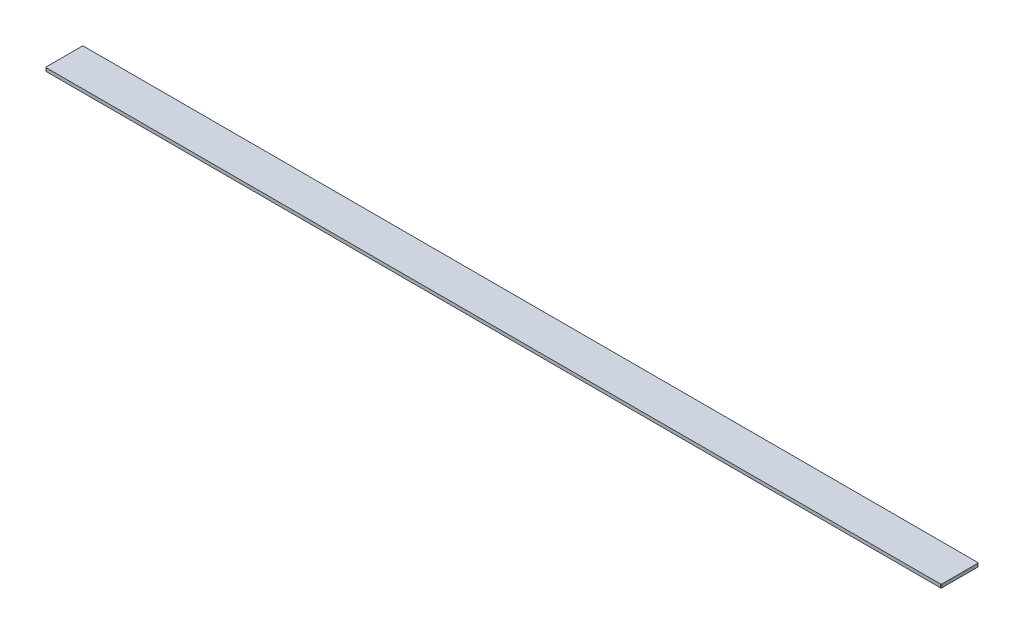
ISO-10303-21;
HEADER;
FILE_DESCRIPTION(('STEP AP214'),'2;1');
FILE_NAME('part.step','',(''),(''),'','','');
FILE_SCHEMA(('AUTOMOTIVE_DESIGN { 1 0 10303 214 1 1 1 1 }'));
ENDSEC;
DATA;
#1=APPLICATION_CONTEXT('core data for automotive mechanical design processes');
#2=APPLICATION_PROTOCOL_DEFINITION('international standard','automotive_design',2000,#1);
#3=PRODUCT_CONTEXT('',#1,'mechanical');
#4=PRODUCT('Part','Part','',(#3));
#5=PRODUCT_RELATED_PRODUCT_CATEGORY('part','',(#4));
#6=PRODUCT_DEFINITION_FORMATION('','',#4);
#7=PRODUCT_DEFINITION_CONTEXT('part definition',#1,'design');
#8=PRODUCT_DEFINITION('design','',#6,#7);
#9=PRODUCT_DEFINITION_SHAPE('','',#8);
#10=(LENGTH_UNIT() NAMED_UNIT(*) SI_UNIT(.MILLI.,.METRE.));
#11=(NAMED_UNIT(*) PLANE_ANGLE_UNIT() SI_UNIT($,.RADIAN.));
#12=(NAMED_UNIT(*) SI_UNIT($,.STERADIAN.) SOLID_ANGLE_UNIT());
#13=UNCERTAINTY_MEASURE_WITH_UNIT(LENGTH_MEASURE(1.E-05),#10,'distance_accuracy_value','');
#14=(GEOMETRIC_REPRESENTATION_CONTEXT(3) GLOBAL_UNCERTAINTY_ASSIGNED_CONTEXT((#13)) GLOBAL_UNIT_ASSIGNED_CONTEXT((#10,
#11,#12)) REPRESENTATION_CONTEXT('',''));
#15=CARTESIAN_POINT('',(0.,0.,0.));
#16=DIRECTION('',(0.,0.,1.));
#17=DIRECTION('',(1.,0.,0.));
#18=AXIS2_PLACEMENT_3D('',#15,#16,#17);
#19=CARTESIAN_POINT('',(-270.,2.,11.25));
#20=DIRECTION('',(1.,0.,0.));
#21=DIRECTION('',(0.,0.,-1.));
#22=AXIS2_PLACEMENT_3D('',#19,#20,#21);
#23=PLANE('',#22);
#24=DIRECTION('',(0.,0.,1.));
#25=VECTOR('',#24,1.);
#26=CARTESIAN_POINT('',(-270.,2.,11.25));
#27=LINE('',#26,#25);
#28=CARTESIAN_POINT('',(-270.,2.,-10.75));
#29=VERTEX_POINT('',#28);
#30=CARTESIAN_POINT('',(-270.,2.,10.75));
#31=VERTEX_POINT('',#30);
#32=EDGE_CURVE('E120',#29,#31,#27,.T.);
#33=ORIENTED_EDGE('',*,*,#32,.F.);
#34=DIRECTION('',(0.,-1.,0.));
#35=VECTOR('',#34,1.);
#36=CARTESIAN_POINT('',(-270.,2.,-10.75));
#37=LINE('',#36,#35);
#38=CARTESIAN_POINT('',(-270.,0.,-10.75));
#39=VERTEX_POINT('',#38);
#40=EDGE_CURVE('E105',#29,#39,#37,.T.);
#41=ORIENTED_EDGE('',*,*,#40,.T.);
#42=DIRECTION('',(0.,0.,1.));
#43=VECTOR('',#42,1.);
#44=CARTESIAN_POINT('',(-270.,0.,11.25));
#45=LINE('',#44,#43);
#46=CARTESIAN_POINT('',(-270.,0.,10.75));
#47=VERTEX_POINT('',#46);
#48=EDGE_CURVE('E117',#39,#47,#45,.T.);
#49=ORIENTED_EDGE('',*,*,#48,.T.);
#50=DIRECTION('',(0.,-1.,0.));
#51=VECTOR('',#50,1.);
#52=CARTESIAN_POINT('',(-270.,2.,10.75));
#53=LINE('',#52,#51);
#54=EDGE_CURVE('E122',#47,#31,#53,.F.);
#55=ORIENTED_EDGE('',*,*,#54,.T.);
#56=EDGE_LOOP('',(#33,#41,#49,#55));
#57=FACE_BOUND('',#56,.T.);
#58=ADVANCED_FACE('F35',(#57),#23,.F.);
#59=CARTESIAN_POINT('',(270.,2.,11.25));
#60=DIRECTION('',(0.,0.,-1.));
#61=DIRECTION('',(-1.,0.,0.));
#62=AXIS2_PLACEMENT_3D('',#59,#60,#61);
#63=PLANE('',#62);
#64=DIRECTION('',(1.,0.,0.));
#65=VECTOR('',#64,1.);
#66=CARTESIAN_POINT('',(270.,0.,11.25));
#67=LINE('',#66,#65);
#68=CARTESIAN_POINT('',(-269.5,0.,11.25));
#69=VERTEX_POINT('',#68);
#70=CARTESIAN_POINT('',(269.5,0.,11.25));
#71=VERTEX_POINT('',#70);
#72=EDGE_CURVE('E126',#69,#71,#67,.T.);
#73=ORIENTED_EDGE('',*,*,#72,.T.);
#74=DIRECTION('',(0.,-1.,0.));
#75=VECTOR('',#74,1.);
#76=CARTESIAN_POINT('',(269.5,2.,11.25));
#77=LINE('',#76,#75);
#78=CARTESIAN_POINT('',(269.5,2.,11.25));
#79=VERTEX_POINT('',#78);
#80=EDGE_CURVE('E11',#71,#79,#77,.F.);
#81=ORIENTED_EDGE('',*,*,#80,.T.);
#82=DIRECTION('',(1.,0.,0.));
#83=VECTOR('',#82,1.);
#84=CARTESIAN_POINT('',(270.,2.,11.25));
#85=LINE('',#84,#83);
#86=CARTESIAN_POINT('',(-269.5,2.,11.25));
#87=VERTEX_POINT('',#86);
#88=EDGE_CURVE('E162',#87,#79,#85,.T.);
#89=ORIENTED_EDGE('',*,*,#88,.F.);
#90=DIRECTION('',(0.,-1.,0.));
#91=VECTOR('',#90,1.);
#92=CARTESIAN_POINT('',(-269.5,2.,11.25));
#93=LINE('',#92,#91);
#94=EDGE_CURVE('E43',#87,#69,#93,.T.);
#95=ORIENTED_EDGE('',*,*,#94,.T.);
#96=EDGE_LOOP('',(#73,#81,#89,#95));
#97=FACE_BOUND('',#96,.T.);
#98=ADVANCED_FACE('F160',(#97),#63,.F.);
#99=CARTESIAN_POINT('',(270.,2.,11.25));
#100=DIRECTION('',(-1.,0.,0.));
#101=DIRECTION('',(0.,0.,1.));
#102=AXIS2_PLACEMENT_3D('',#99,#100,#101);
#103=PLANE('',#102);
#104=DIRECTION('',(0.,0.,-1.));
#105=VECTOR('',#104,1.);
#106=CARTESIAN_POINT('',(270.,0.,11.25));
#107=LINE('',#106,#105);
#108=CARTESIAN_POINT('',(270.,0.,10.75));
#109=VERTEX_POINT('',#108);
#110=CARTESIAN_POINT('',(270.,0.,-10.75));
#111=VERTEX_POINT('',#110);
#112=EDGE_CURVE('E129',#109,#111,#107,.T.);
#113=ORIENTED_EDGE('',*,*,#112,.T.);
#114=DIRECTION('',(0.,-1.,0.));
#115=VECTOR('',#114,1.);
#116=CARTESIAN_POINT('',(270.,2.,-10.75));
#117=LINE('',#116,#115);
#118=CARTESIAN_POINT('',(270.,2.,-10.75));
#119=VERTEX_POINT('',#118);
#120=EDGE_CURVE('E50',#111,#119,#117,.F.);
#121=ORIENTED_EDGE('',*,*,#120,.T.);
#122=DIRECTION('',(0.,0.,-1.));
#123=VECTOR('',#122,1.);
#124=CARTESIAN_POINT('',(270.,2.,11.25));
#125=LINE('',#124,#123);
#126=CARTESIAN_POINT('',(270.,2.,10.75));
#127=VERTEX_POINT('',#126);
#128=EDGE_CURVE('E170',#127,#119,#125,.T.);
#129=ORIENTED_EDGE('',*,*,#128,.F.);
#130=DIRECTION('',(0.,-1.,0.));
#131=VECTOR('',#130,1.);
#132=CARTESIAN_POINT('',(270.,2.,10.75));
#133=LINE('',#132,#131);
#134=EDGE_CURVE('E153',#127,#109,#133,.T.);
#135=ORIENTED_EDGE('',*,*,#134,.T.);
#136=EDGE_LOOP('',(#113,#121,#129,#135));
#137=FACE_BOUND('',#136,.T.);
#138=ADVANCED_FACE('F169',(#137),#103,.F.);
#139=CARTESIAN_POINT('',(270.,2.,-11.25));
#140=DIRECTION('',(0.,0.,1.));
#141=DIRECTION('',(1.,0.,0.));
#142=AXIS2_PLACEMENT_3D('',#139,#140,#141);
#143=PLANE('',#142);
#144=DIRECTION('',(-1.,0.,0.));
#145=VECTOR('',#144,1.);
#146=CARTESIAN_POINT('',(270.,0.,-11.25));
#147=LINE('',#146,#145);
#148=CARTESIAN_POINT('',(269.5,0.,-11.25));
#149=VERTEX_POINT('',#148);
#150=CARTESIAN_POINT('',(-269.5,0.,-11.25));
#151=VERTEX_POINT('',#150);
#152=EDGE_CURVE('E136',#149,#151,#147,.T.);
#153=ORIENTED_EDGE('',*,*,#152,.T.);
#154=DIRECTION('',(0.,-1.,0.));
#155=VECTOR('',#154,1.);
#156=CARTESIAN_POINT('',(-269.5,2.,-11.25));
#157=LINE('',#156,#155);
#158=CARTESIAN_POINT('',(-269.5,2.,-11.25));
#159=VERTEX_POINT('',#158);
#160=EDGE_CURVE('E106',#151,#159,#157,.F.);
#161=ORIENTED_EDGE('',*,*,#160,.T.);
#162=DIRECTION('',(-1.,0.,0.));
#163=VECTOR('',#162,1.);
#164=CARTESIAN_POINT('',(270.,2.,-11.25));
#165=LINE('',#164,#163);
#166=CARTESIAN_POINT('',(269.5,2.,-11.25));
#167=VERTEX_POINT('',#166);
#168=EDGE_CURVE('E132',#167,#159,#165,.T.);
#169=ORIENTED_EDGE('',*,*,#168,.F.);
#170=DIRECTION('',(0.,-1.,0.));
#171=VECTOR('',#170,1.);
#172=CARTESIAN_POINT('',(269.5,2.,-11.25));
#173=LINE('',#172,#171);
#174=EDGE_CURVE('E111',#167,#149,#173,.T.);
#175=ORIENTED_EDGE('',*,*,#174,.T.);
#176=EDGE_LOOP('',(#153,#161,#169,#175));
#177=FACE_BOUND('',#176,.T.);
#178=ADVANCED_FACE('F198',(#177),#143,.F.);
#179=CARTESIAN_POINT('',(0.,2.,0.));
#180=DIRECTION('',(0.,1.,0.));
#181=DIRECTION('',(0.,0.,1.));
#182=AXIS2_PLACEMENT_3D('',#179,#180,#181);
#183=PLANE('',#182);
#184=ORIENTED_EDGE('',*,*,#168,.T.);
#185=CARTESIAN_POINT('',(-269.5,2.,-10.75));
#186=DIRECTION('',(0.,1.,0.));
#187=DIRECTION('',(0.,0.,1.));
#188=AXIS2_PLACEMENT_3D('',#185,#186,#187);
#189=CIRCLE('',#188,0.5);
#190=EDGE_CURVE('E151',#159,#29,#189,.T.);
#191=ORIENTED_EDGE('',*,*,#190,.T.);
#192=ORIENTED_EDGE('',*,*,#32,.T.);
#193=CARTESIAN_POINT('',(-269.5,2.,10.75));
#194=DIRECTION('',(0.,1.,0.));
#195=DIRECTION('',(0.,0.,1.));
#196=AXIS2_PLACEMENT_3D('',#193,#194,#195);
#197=CIRCLE('',#196,0.5);
#198=EDGE_CURVE('E146',#31,#87,#197,.T.);
#199=ORIENTED_EDGE('',*,*,#198,.T.);
#200=ORIENTED_EDGE('',*,*,#88,.T.);
#201=CARTESIAN_POINT('',(269.5,2.,10.75));
#202=DIRECTION('',(0.,1.,0.));
#203=DIRECTION('',(0.,0.,1.));
#204=AXIS2_PLACEMENT_3D('',#201,#202,#203);
#205=CIRCLE('',#204,0.5);
#206=EDGE_CURVE('E57',#79,#127,#205,.T.);
#207=ORIENTED_EDGE('',*,*,#206,.T.);
#208=ORIENTED_EDGE('',*,*,#128,.T.);
#209=CARTESIAN_POINT('',(269.5,2.,-10.75));
#210=DIRECTION('',(0.,1.,0.));
#211=DIRECTION('',(0.,0.,1.));
#212=AXIS2_PLACEMENT_3D('',#209,#210,#211);
#213=CIRCLE('',#212,0.5);
#214=EDGE_CURVE('E149',#119,#167,#213,.T.);
#215=ORIENTED_EDGE('',*,*,#214,.T.);
#216=EDGE_LOOP('',(#184,#191,#192,#199,#200,#207,#208,#215));
#217=FACE_BOUND('',#216,.T.);
#218=ADVANCED_FACE('F175',(#217),#183,.T.);
#219=CARTESIAN_POINT('',(0.,0.,0.));
#220=DIRECTION('',(0.,1.,0.));
#221=DIRECTION('',(0.,0.,1.));
#222=AXIS2_PLACEMENT_3D('',#219,#220,#221);
#223=PLANE('',#222);
#224=ORIENTED_EDGE('',*,*,#48,.F.);
#225=CARTESIAN_POINT('',(-269.5,0.,-10.75));
#226=DIRECTION('',(0.,1.,0.));
#227=DIRECTION('',(0.,0.,1.));
#228=AXIS2_PLACEMENT_3D('',#225,#226,#227);
#229=CIRCLE('',#228,0.5);
#230=EDGE_CURVE('E101',#39,#151,#229,.F.);
#231=ORIENTED_EDGE('',*,*,#230,.T.);
#232=ORIENTED_EDGE('',*,*,#152,.F.);
#233=CARTESIAN_POINT('',(269.5,0.,-10.75));
#234=DIRECTION('',(0.,1.,0.));
#235=DIRECTION('',(0.,0.,1.));
#236=AXIS2_PLACEMENT_3D('',#233,#234,#235);
#237=CIRCLE('',#236,0.5);
#238=EDGE_CURVE('E112',#149,#111,#237,.F.);
#239=ORIENTED_EDGE('',*,*,#238,.T.);
#240=ORIENTED_EDGE('',*,*,#112,.F.);
#241=CARTESIAN_POINT('',(269.5,0.,10.75));
#242=DIRECTION('',(0.,1.,0.));
#243=DIRECTION('',(0.,0.,1.));
#244=AXIS2_PLACEMENT_3D('',#241,#242,#243);
#245=CIRCLE('',#244,0.5);
#246=EDGE_CURVE('E140',#109,#71,#245,.F.);
#247=ORIENTED_EDGE('',*,*,#246,.T.);
#248=ORIENTED_EDGE('',*,*,#72,.F.);
#249=CARTESIAN_POINT('',(-269.5,0.,10.75));
#250=DIRECTION('',(0.,1.,0.));
#251=DIRECTION('',(0.,0.,1.));
#252=AXIS2_PLACEMENT_3D('',#249,#250,#251);
#253=CIRCLE('',#252,0.5);
#254=EDGE_CURVE('E121',#69,#47,#253,.F.);
#255=ORIENTED_EDGE('',*,*,#254,.T.);
#256=EDGE_LOOP('',(#224,#231,#232,#239,#240,#247,#248,#255));
#257=FACE_BOUND('',#256,.T.);
#258=ADVANCED_FACE('F124',(#257),#223,.F.);
#259=CARTESIAN_POINT('',(-269.5,2.,-10.75));
#260=DIRECTION('',(0.,-1.,0.));
#261=DIRECTION('',(0.,0.,-1.));
#262=AXIS2_PLACEMENT_3D('',#259,#260,#261);
#263=CYLINDRICAL_SURFACE('',#262,0.5);
#264=ORIENTED_EDGE('',*,*,#190,.F.);
#265=ORIENTED_EDGE('',*,*,#160,.F.);
#266=ORIENTED_EDGE('',*,*,#230,.F.);
#267=ORIENTED_EDGE('',*,*,#40,.F.);
#268=EDGE_LOOP('',(#264,#265,#266,#267));
#269=FACE_BOUND('',#268,.T.);
#270=ADVANCED_FACE('F104',(#269),#263,.T.);
#271=CARTESIAN_POINT('',(269.5,2.,-10.75));
#272=DIRECTION('',(0.,-1.,0.));
#273=DIRECTION('',(0.,0.,-1.));
#274=AXIS2_PLACEMENT_3D('',#271,#272,#273);
#275=CYLINDRICAL_SURFACE('',#274,0.5);
#276=ORIENTED_EDGE('',*,*,#214,.F.);
#277=ORIENTED_EDGE('',*,*,#120,.F.);
#278=ORIENTED_EDGE('',*,*,#238,.F.);
#279=ORIENTED_EDGE('',*,*,#174,.F.);
#280=EDGE_LOOP('',(#276,#277,#278,#279));
#281=FACE_BOUND('',#280,.T.);
#282=ADVANCED_FACE('F180',(#281),#275,.T.);
#283=CARTESIAN_POINT('',(269.5,2.,10.75));
#284=DIRECTION('',(0.,-1.,0.));
#285=DIRECTION('',(0.,0.,-1.));
#286=AXIS2_PLACEMENT_3D('',#283,#284,#285);
#287=CYLINDRICAL_SURFACE('',#286,0.5);
#288=ORIENTED_EDGE('',*,*,#206,.F.);
#289=ORIENTED_EDGE('',*,*,#80,.F.);
#290=ORIENTED_EDGE('',*,*,#246,.F.);
#291=ORIENTED_EDGE('',*,*,#134,.F.);
#292=EDGE_LOOP('',(#288,#289,#290,#291));
#293=FACE_BOUND('',#292,.T.);
#294=ADVANCED_FACE('F168',(#293),#287,.T.);
#295=CARTESIAN_POINT('',(-269.5,2.,10.75));
#296=DIRECTION('',(0.,-1.,0.));
#297=DIRECTION('',(0.,0.,-1.));
#298=AXIS2_PLACEMENT_3D('',#295,#296,#297);
#299=CYLINDRICAL_SURFACE('',#298,0.5);
#300=ORIENTED_EDGE('',*,*,#198,.F.);
#301=ORIENTED_EDGE('',*,*,#54,.F.);
#302=ORIENTED_EDGE('',*,*,#254,.F.);
#303=ORIENTED_EDGE('',*,*,#94,.F.);
#304=EDGE_LOOP('',(#300,#301,#302,#303));
#305=FACE_BOUND('',#304,.T.);
#306=ADVANCED_FACE('F37',(#305),#299,.T.);
#307=CLOSED_SHELL('',(#58,#98,#138,#178,#218,#258,#270,#282,#294,#306));
#308=MANIFOLD_SOLID_BREP('B2',#307);
#309=ADVANCED_BREP_SHAPE_REPRESENTATION('',(#18,#308),#14);
#310=SHAPE_DEFINITION_REPRESENTATION(#9,#309);
ENDSEC;
END-ISO-10303-21;
